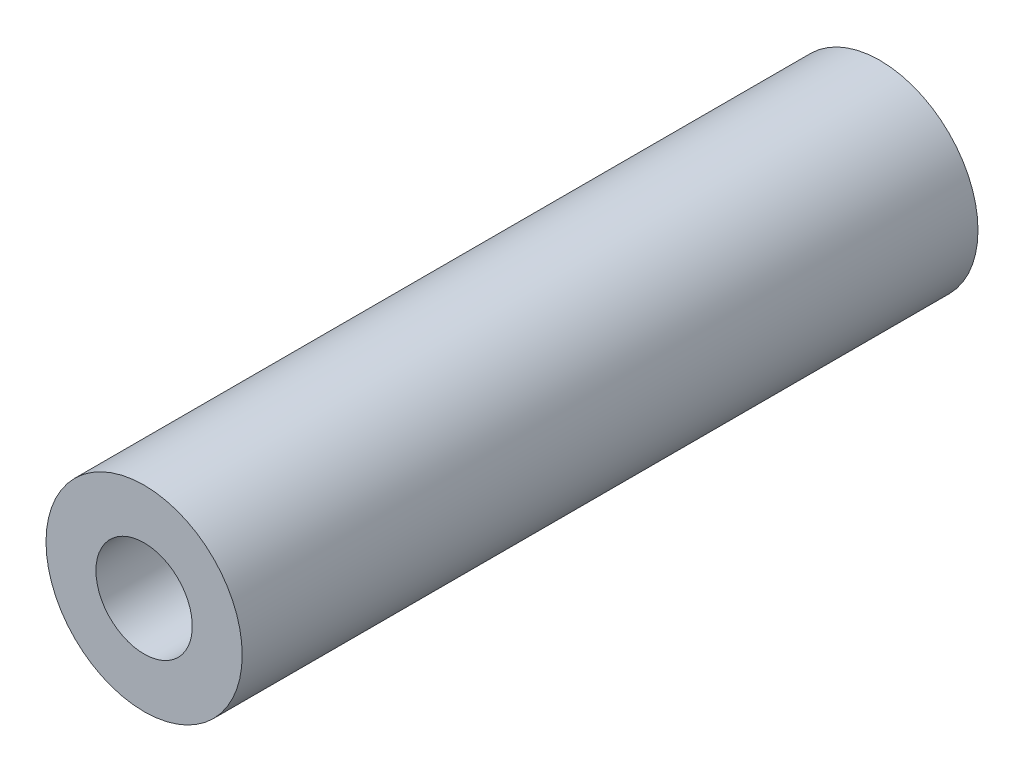
ISO-10303-21;
HEADER;
FILE_DESCRIPTION(('STEP AP214'),'2;1');
FILE_NAME('part.step','',(''),(''),'','','');
FILE_SCHEMA(('AUTOMOTIVE_DESIGN { 1 0 10303 214 1 1 1 1 }'));
ENDSEC;
DATA;
#1=APPLICATION_CONTEXT('core data for automotive mechanical design processes');
#2=APPLICATION_PROTOCOL_DEFINITION('international standard','automotive_design',2000,#1);
#3=PRODUCT_CONTEXT('',#1,'mechanical');
#4=PRODUCT('Part','Part','',(#3));
#5=PRODUCT_RELATED_PRODUCT_CATEGORY('part','',(#4));
#6=PRODUCT_DEFINITION_FORMATION('','',#4);
#7=PRODUCT_DEFINITION_CONTEXT('part definition',#1,'design');
#8=PRODUCT_DEFINITION('design','',#6,#7);
#9=PRODUCT_DEFINITION_SHAPE('','',#8);
#10=(LENGTH_UNIT() NAMED_UNIT(*) SI_UNIT(.MILLI.,.METRE.));
#11=(NAMED_UNIT(*) PLANE_ANGLE_UNIT() SI_UNIT($,.RADIAN.));
#12=(NAMED_UNIT(*) SI_UNIT($,.STERADIAN.) SOLID_ANGLE_UNIT());
#13=UNCERTAINTY_MEASURE_WITH_UNIT(LENGTH_MEASURE(1.E-05),#10,'distance_accuracy_value','');
#14=(GEOMETRIC_REPRESENTATION_CONTEXT(3) GLOBAL_UNCERTAINTY_ASSIGNED_CONTEXT((#13)) GLOBAL_UNIT_ASSIGNED_CONTEXT((#10,
#11,#12)) REPRESENTATION_CONTEXT('',''));
#15=CARTESIAN_POINT('',(0.,0.,0.));
#16=DIRECTION('',(0.,0.,1.));
#17=DIRECTION('',(1.,0.,0.));
#18=AXIS2_PLACEMENT_3D('',#15,#16,#17);
#19=CARTESIAN_POINT('',(0.,0.,38.1));
#20=DIRECTION('',(0.,0.,-1.));
#21=DIRECTION('',(-1.,0.,0.));
#22=AXIS2_PLACEMENT_3D('',#19,#20,#21);
#23=CYLINDRICAL_SURFACE('',#22,5.08);
#24=CARTESIAN_POINT('',(0.,0.,38.1));
#25=DIRECTION('',(0.,0.,1.));
#26=DIRECTION('',(1.,0.,0.));
#27=AXIS2_PLACEMENT_3D('',#24,#25,#26);
#28=CIRCLE('',#27,5.08);
#29=CARTESIAN_POINT('',(-5.08,0.,38.1));
#30=VERTEX_POINT('',#29);
#31=EDGE_CURVE('E10',#30,#30,#28,.T.);
#32=CARTESIAN_POINT('',(0.,0.,0.));
#33=DIRECTION('',(0.,0.,1.));
#34=DIRECTION('',(1.,0.,0.));
#35=AXIS2_PLACEMENT_3D('',#32,#33,#34);
#36=CIRCLE('',#35,5.08);
#37=CARTESIAN_POINT('',(-5.08,0.,0.));
#38=VERTEX_POINT('',#37);
#39=EDGE_CURVE('E51',#38,#38,#36,.T.);
#40=CARTESIAN_POINT('',(-5.08,0.,38.1));
#41=CARTESIAN_POINT('',(-5.08,0.,37.703125));
#42=CARTESIAN_POINT('',(-5.08,0.,37.30625));
#43=CARTESIAN_POINT('',(-5.08,0.,36.5125));
#44=CARTESIAN_POINT('',(-5.08,0.,36.115625));
#45=CARTESIAN_POINT('',(-5.08,0.,35.321875));
#46=CARTESIAN_POINT('',(-5.08,0.,34.925));
#47=CARTESIAN_POINT('',(-5.08,0.,34.13125));
#48=CARTESIAN_POINT('',(-5.08,0.,33.734375));
#49=CARTESIAN_POINT('',(-5.08,0.,32.940625));
#50=CARTESIAN_POINT('',(-5.08,0.,32.54375));
#51=CARTESIAN_POINT('',(-5.08,0.,31.75));
#52=CARTESIAN_POINT('',(-5.08,0.,31.353125));
#53=CARTESIAN_POINT('',(-5.08,0.,30.559375));
#54=CARTESIAN_POINT('',(-5.08,0.,30.1625));
#55=CARTESIAN_POINT('',(-5.08,0.,29.36875));
#56=CARTESIAN_POINT('',(-5.08,0.,28.971875));
#57=CARTESIAN_POINT('',(-5.08,0.,28.178125));
#58=CARTESIAN_POINT('',(-5.08,0.,27.78125));
#59=CARTESIAN_POINT('',(-5.08,0.,26.9875));
#60=CARTESIAN_POINT('',(-5.08,0.,26.590625));
#61=CARTESIAN_POINT('',(-5.08,0.,25.796875));
#62=CARTESIAN_POINT('',(-5.08,0.,25.4));
#63=CARTESIAN_POINT('',(-5.08,0.,24.60625));
#64=CARTESIAN_POINT('',(-5.08,0.,24.209375));
#65=CARTESIAN_POINT('',(-5.08,0.,23.415625));
#66=CARTESIAN_POINT('',(-5.08,0.,23.01875));
#67=CARTESIAN_POINT('',(-5.08,0.,22.225));
#68=CARTESIAN_POINT('',(-5.08,0.,21.828125));
#69=CARTESIAN_POINT('',(-5.08,0.,21.034375));
#70=CARTESIAN_POINT('',(-5.08,0.,20.6375));
#71=CARTESIAN_POINT('',(-5.08,0.,19.84375));
#72=CARTESIAN_POINT('',(-5.08,0.,19.446875));
#73=CARTESIAN_POINT('',(-5.08,0.,18.653125));
#74=CARTESIAN_POINT('',(-5.08,0.,18.25625));
#75=CARTESIAN_POINT('',(-5.08,0.,17.4625));
#76=CARTESIAN_POINT('',(-5.08,0.,17.065625));
#77=CARTESIAN_POINT('',(-5.08,0.,16.271875));
#78=CARTESIAN_POINT('',(-5.08,0.,15.875));
#79=CARTESIAN_POINT('',(-5.08,0.,15.08125));
#80=CARTESIAN_POINT('',(-5.08,0.,14.684375));
#81=CARTESIAN_POINT('',(-5.08,0.,13.890625));
#82=CARTESIAN_POINT('',(-5.08,0.,13.49375));
#83=CARTESIAN_POINT('',(-5.08,0.,12.7));
#84=CARTESIAN_POINT('',(-5.08,0.,12.303125));
#85=CARTESIAN_POINT('',(-5.08,0.,11.509375));
#86=CARTESIAN_POINT('',(-5.08,0.,11.1125));
#87=CARTESIAN_POINT('',(-5.08,0.,10.31875));
#88=CARTESIAN_POINT('',(-5.08,0.,9.921875));
#89=CARTESIAN_POINT('',(-5.08,0.,9.128125));
#90=CARTESIAN_POINT('',(-5.08,0.,8.73125));
#91=CARTESIAN_POINT('',(-5.08,0.,7.9375));
#92=CARTESIAN_POINT('',(-5.08,0.,7.540625));
#93=CARTESIAN_POINT('',(-5.08,0.,6.746875));
#94=CARTESIAN_POINT('',(-5.08,0.,6.35));
#95=CARTESIAN_POINT('',(-5.08,0.,5.55625));
#96=CARTESIAN_POINT('',(-5.08,0.,5.159375));
#97=CARTESIAN_POINT('',(-5.08,0.,4.365625));
#98=CARTESIAN_POINT('',(-5.08,0.,3.96875));
#99=CARTESIAN_POINT('',(-5.08,0.,3.175));
#100=CARTESIAN_POINT('',(-5.08,0.,2.778125));
#101=CARTESIAN_POINT('',(-5.08,0.,1.984375));
#102=CARTESIAN_POINT('',(-5.08,0.,1.5875));
#103=CARTESIAN_POINT('',(-5.08,0.,0.79375));
#104=CARTESIAN_POINT('',(-5.08,0.,0.396875));
#105=CARTESIAN_POINT('',(-5.08,0.,0.));
#106=B_SPLINE_CURVE_WITH_KNOTS('',3,(#40,#41,#42,#43,#44,#45,#46,#47,#48,#49,#50,#51,#52,#53,
#54,#55,#56,#57,#58,#59,#60,#61,#62,#63,#64,#65,#66,#67,#68,#69,#70,#71,#72,#73,#74,#75,#76,#77,
#78,#79,#80,#81,#82,#83,#84,#85,#86,#87,#88,#89,#90,#91,#92,#93,#94,#95,#96,#97,#98,#99,#100,
#101,#102,#103,#104,#105),.UNSPECIFIED.,.F.,.F.,(4,2,2,2,2,2,2,2,2,2,2,2,2,2,2,2,2,2,2,2,2,2,2,
2,2,2,2,2,2,2,2,2,4),(0.,1.19062499999999,2.38124999999999,3.571875,4.7625,5.953125,7.14375,
8.33437499999999,9.525,10.715625,11.90625,13.096875,14.2875,15.478125,16.66875,17.859375,19.05,
20.240625,21.43125,22.621875,23.8125,25.003125,26.19375,27.384375,28.575,29.765625,30.95625,
32.146875,33.3375,34.528125,35.71875,36.909375,38.1),.UNSPECIFIED.);
#107=EDGE_CURVE('BSEAM43',#30,#38,#106,.T.);
#108=ORIENTED_EDGE('',*,*,#31,.F.);
#109=ORIENTED_EDGE('',*,*,#39,.T.);
#110=ORIENTED_EDGE('',*,*,#107,.T.);
#111=ORIENTED_EDGE('',*,*,#107,.F.);
#112=EDGE_LOOP('',(#108,#110,#109,#111));
#113=FACE_BOUND('',#112,.T.);
#114=ADVANCED_FACE('F43',(#113),#23,.T.);
#115=CARTESIAN_POINT('',(0.,0.,38.1));
#116=DIRECTION('',(0.,0.,1.));
#117=DIRECTION('',(1.,0.,0.));
#118=AXIS2_PLACEMENT_3D('',#115,#116,#117);
#119=PLANE('',#118);
#120=CARTESIAN_POINT('',(0.,0.,38.1));
#121=DIRECTION('',(0.,0.,-1.));
#122=DIRECTION('',(-1.,0.,0.));
#123=AXIS2_PLACEMENT_3D('',#120,#121,#122);
#124=CIRCLE('',#123,2.49484645669806);
#125=CARTESIAN_POINT('',(-2.49484645669806,0.,38.1));
#126=VERTEX_POINT('',#125);
#127=EDGE_CURVE('E58',#126,#126,#124,.T.);
#128=ORIENTED_EDGE('',*,*,#127,.T.);
#129=EDGE_LOOP('',(#128));
#130=FACE_BOUND('',#129,.T.);
#131=ORIENTED_EDGE('',*,*,#31,.T.);
#132=EDGE_LOOP('',(#131));
#133=FACE_BOUND('',#132,.T.);
#134=ADVANCED_FACE('F77',(#130,#133),#119,.T.);
#135=CARTESIAN_POINT('',(0.,0.,0.));
#136=DIRECTION('',(0.,0.,1.));
#137=DIRECTION('',(1.,0.,0.));
#138=AXIS2_PLACEMENT_3D('',#135,#136,#137);
#139=PLANE('',#138);
#140=CARTESIAN_POINT('',(0.,0.,0.));
#141=DIRECTION('',(0.,0.,1.));
#142=DIRECTION('',(1.,0.,0.));
#143=AXIS2_PLACEMENT_3D('',#140,#141,#142);
#144=CIRCLE('',#143,2.49484645669806);
#145=CARTESIAN_POINT('',(-2.49484645669806,0.,0.));
#146=VERTEX_POINT('',#145);
#147=EDGE_CURVE('E46',#146,#146,#144,.T.);
#148=ORIENTED_EDGE('',*,*,#147,.T.);
#149=EDGE_LOOP('',(#148));
#150=FACE_BOUND('',#149,.T.);
#151=ORIENTED_EDGE('',*,*,#39,.F.);
#152=EDGE_LOOP('',(#151));
#153=FACE_BOUND('',#152,.T.);
#154=ADVANCED_FACE('F67',(#150,#153),#139,.F.);
#155=CARTESIAN_POINT('',(0.,0.,38.1));
#156=DIRECTION('',(0.,0.,-1.));
#157=DIRECTION('',(-1.,0.,0.));
#158=AXIS2_PLACEMENT_3D('',#155,#156,#157);
#159=CYLINDRICAL_SURFACE('',#158,2.49484645669806);
#160=CARTESIAN_POINT('',(-2.49484645669806,0.,38.1));
#161=CARTESIAN_POINT('',(-2.49484645669806,0.,37.703125));
#162=CARTESIAN_POINT('',(-2.49484645669806,0.,37.30625));
#163=CARTESIAN_POINT('',(-2.49484645669806,0.,36.5125));
#164=CARTESIAN_POINT('',(-2.49484645669806,0.,36.115625));
#165=CARTESIAN_POINT('',(-2.49484645669806,0.,35.321875));
#166=CARTESIAN_POINT('',(-2.49484645669806,0.,34.925));
#167=CARTESIAN_POINT('',(-2.49484645669806,0.,34.13125));
#168=CARTESIAN_POINT('',(-2.49484645669806,0.,33.734375));
#169=CARTESIAN_POINT('',(-2.49484645669806,0.,32.940625));
#170=CARTESIAN_POINT('',(-2.49484645669806,0.,32.54375));
#171=CARTESIAN_POINT('',(-2.49484645669806,0.,31.75));
#172=CARTESIAN_POINT('',(-2.49484645669806,0.,31.353125));
#173=CARTESIAN_POINT('',(-2.49484645669806,0.,30.559375));
#174=CARTESIAN_POINT('',(-2.49484645669806,0.,30.1625));
#175=CARTESIAN_POINT('',(-2.49484645669806,0.,29.36875));
#176=CARTESIAN_POINT('',(-2.49484645669806,0.,28.971875));
#177=CARTESIAN_POINT('',(-2.49484645669806,0.,28.178125));
#178=CARTESIAN_POINT('',(-2.49484645669806,0.,27.78125));
#179=CARTESIAN_POINT('',(-2.49484645669806,0.,26.9875));
#180=CARTESIAN_POINT('',(-2.49484645669806,0.,26.590625));
#181=CARTESIAN_POINT('',(-2.49484645669806,0.,25.796875));
#182=CARTESIAN_POINT('',(-2.49484645669806,0.,25.4));
#183=CARTESIAN_POINT('',(-2.49484645669806,0.,24.60625));
#184=CARTESIAN_POINT('',(-2.49484645669806,0.,24.209375));
#185=CARTESIAN_POINT('',(-2.49484645669806,0.,23.415625));
#186=CARTESIAN_POINT('',(-2.49484645669806,0.,23.01875));
#187=CARTESIAN_POINT('',(-2.49484645669806,0.,22.225));
#188=CARTESIAN_POINT('',(-2.49484645669806,0.,21.828125));
#189=CARTESIAN_POINT('',(-2.49484645669806,0.,21.034375));
#190=CARTESIAN_POINT('',(-2.49484645669806,0.,20.6375));
#191=CARTESIAN_POINT('',(-2.49484645669806,0.,19.84375));
#192=CARTESIAN_POINT('',(-2.49484645669806,0.,19.446875));
#193=CARTESIAN_POINT('',(-2.49484645669806,0.,18.653125));
#194=CARTESIAN_POINT('',(-2.49484645669806,0.,18.25625));
#195=CARTESIAN_POINT('',(-2.49484645669806,0.,17.4625));
#196=CARTESIAN_POINT('',(-2.49484645669806,0.,17.065625));
#197=CARTESIAN_POINT('',(-2.49484645669806,0.,16.271875));
#198=CARTESIAN_POINT('',(-2.49484645669806,0.,15.875));
#199=CARTESIAN_POINT('',(-2.49484645669806,0.,15.08125));
#200=CARTESIAN_POINT('',(-2.49484645669806,0.,14.684375));
#201=CARTESIAN_POINT('',(-2.49484645669806,0.,13.890625));
#202=CARTESIAN_POINT('',(-2.49484645669806,0.,13.49375));
#203=CARTESIAN_POINT('',(-2.49484645669806,0.,12.7));
#204=CARTESIAN_POINT('',(-2.49484645669806,0.,12.303125));
#205=CARTESIAN_POINT('',(-2.49484645669806,0.,11.509375));
#206=CARTESIAN_POINT('',(-2.49484645669806,0.,11.1125));
#207=CARTESIAN_POINT('',(-2.49484645669806,0.,10.31875));
#208=CARTESIAN_POINT('',(-2.49484645669806,0.,9.921875));
#209=CARTESIAN_POINT('',(-2.49484645669806,0.,9.128125));
#210=CARTESIAN_POINT('',(-2.49484645669806,0.,8.73125));
#211=CARTESIAN_POINT('',(-2.49484645669806,0.,7.9375));
#212=CARTESIAN_POINT('',(-2.49484645669806,0.,7.540625));
#213=CARTESIAN_POINT('',(-2.49484645669806,0.,6.746875));
#214=CARTESIAN_POINT('',(-2.49484645669806,0.,6.35));
#215=CARTESIAN_POINT('',(-2.49484645669806,0.,5.55625));
#216=CARTESIAN_POINT('',(-2.49484645669806,0.,5.159375));
#217=CARTESIAN_POINT('',(-2.49484645669806,0.,4.365625));
#218=CARTESIAN_POINT('',(-2.49484645669806,0.,3.96875));
#219=CARTESIAN_POINT('',(-2.49484645669806,0.,3.175));
#220=CARTESIAN_POINT('',(-2.49484645669806,0.,2.778125));
#221=CARTESIAN_POINT('',(-2.49484645669806,0.,1.984375));
#222=CARTESIAN_POINT('',(-2.49484645669806,0.,1.5875));
#223=CARTESIAN_POINT('',(-2.49484645669806,0.,0.79375));
#224=CARTESIAN_POINT('',(-2.49484645669806,0.,0.396875));
#225=CARTESIAN_POINT('',(-2.49484645669806,0.,0.));
#226=B_SPLINE_CURVE_WITH_KNOTS('',3,(#160,#161,#162,#163,#164,#165,#166,#167,#168,#169,#170,
#171,#172,#173,#174,#175,#176,#177,#178,#179,#180,#181,#182,#183,#184,#185,#186,#187,#188,#189,
#190,#191,#192,#193,#194,#195,#196,#197,#198,#199,#200,#201,#202,#203,#204,#205,#206,#207,#208,
#209,#210,#211,#212,#213,#214,#215,#216,#217,#218,#219,#220,#221,#222,#223,#224,#225),
.UNSPECIFIED.,.F.,.F.,(4,2,2,2,2,2,2,2,2,2,2,2,2,2,2,2,2,2,2,2,2,2,2,2,2,2,2,2,2,2,2,2,4),(0.,
1.190625,2.38125,3.571875,4.7625,5.953125,7.14375,8.334375,9.52500000000001,10.715625,11.90625,
13.096875,14.2875,15.478125,16.66875,17.859375,19.05,20.240625,21.43125,22.621875,23.8125,
25.003125,26.19375,27.384375,28.575,29.765625,30.95625,32.146875,33.3375,34.528125,35.71875,
36.909375,38.1),.UNSPECIFIED.);
#227=EDGE_CURVE('BSEAM70',#126,#146,#226,.T.);
#228=ORIENTED_EDGE('',*,*,#127,.F.);
#229=ORIENTED_EDGE('',*,*,#147,.F.);
#230=ORIENTED_EDGE('',*,*,#227,.T.);
#231=ORIENTED_EDGE('',*,*,#227,.F.);
#232=EDGE_LOOP('',(#228,#230,#229,#231));
#233=FACE_BOUND('',#232,.T.);
#234=ADVANCED_FACE('F70',(#233),#159,.F.);
#235=CLOSED_SHELL('',(#114,#134,#154,#234));
#236=MANIFOLD_SOLID_BREP('B2',#235);
#237=ADVANCED_BREP_SHAPE_REPRESENTATION('',(#18,#236),#14);
#238=SHAPE_DEFINITION_REPRESENTATION(#9,#237);
ENDSEC;
END-ISO-10303-21;
